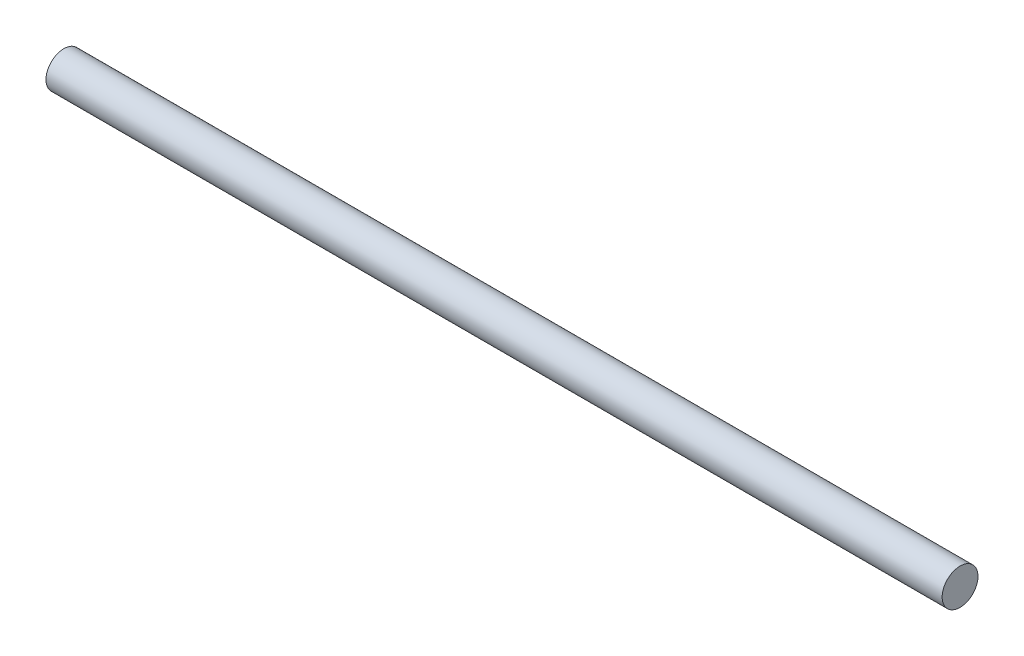
ISO-10303-21;
HEADER;
FILE_DESCRIPTION(('STEP AP214'),'2;1');
FILE_NAME('part.step','',(''),(''),'','','');
FILE_SCHEMA(('AUTOMOTIVE_DESIGN { 1 0 10303 214 1 1 1 1 }'));
ENDSEC;
DATA;
#1=APPLICATION_CONTEXT('core data for automotive mechanical design processes');
#2=APPLICATION_PROTOCOL_DEFINITION('international standard','automotive_design',2000,#1);
#3=PRODUCT_CONTEXT('',#1,'mechanical');
#4=PRODUCT('Part','Part','',(#3));
#5=PRODUCT_RELATED_PRODUCT_CATEGORY('part','',(#4));
#6=PRODUCT_DEFINITION_FORMATION('','',#4);
#7=PRODUCT_DEFINITION_CONTEXT('part definition',#1,'design');
#8=PRODUCT_DEFINITION('design','',#6,#7);
#9=PRODUCT_DEFINITION_SHAPE('','',#8);
#10=(LENGTH_UNIT() NAMED_UNIT(*) SI_UNIT(.MILLI.,.METRE.));
#11=(NAMED_UNIT(*) PLANE_ANGLE_UNIT() SI_UNIT($,.RADIAN.));
#12=(NAMED_UNIT(*) SI_UNIT($,.STERADIAN.) SOLID_ANGLE_UNIT());
#13=UNCERTAINTY_MEASURE_WITH_UNIT(LENGTH_MEASURE(1.E-05),#10,'distance_accuracy_value','');
#14=(GEOMETRIC_REPRESENTATION_CONTEXT(3) GLOBAL_UNCERTAINTY_ASSIGNED_CONTEXT((#13)) GLOBAL_UNIT_ASSIGNED_CONTEXT((#10,
#11,#12)) REPRESENTATION_CONTEXT('',''));
#15=CARTESIAN_POINT('',(0.,0.,0.));
#16=DIRECTION('',(0.,0.,1.));
#17=DIRECTION('',(1.,0.,0.));
#18=AXIS2_PLACEMENT_3D('',#15,#16,#17);
#19=CARTESIAN_POINT('',(300.,0.,0.));
#20=DIRECTION('',(-1.,0.,0.));
#21=DIRECTION('',(0.,0.,1.));
#22=AXIS2_PLACEMENT_3D('',#19,#20,#21);
#23=CYLINDRICAL_SURFACE('',#22,6.);
#24=CARTESIAN_POINT('',(300.,0.,0.));
#25=DIRECTION('',(1.,0.,0.));
#26=DIRECTION('',(0.,0.,-1.));
#27=AXIS2_PLACEMENT_3D('',#24,#25,#26);
#28=CIRCLE('',#27,6.);
#29=CARTESIAN_POINT('',(300.,0.,-6.));
#30=VERTEX_POINT('',#29);
#31=EDGE_CURVE('E10',#30,#30,#28,.T.);
#32=ORIENTED_EDGE('',*,*,#31,.F.);
#33=EDGE_LOOP('',(#32));
#34=FACE_BOUND('',#33,.T.);
#35=CARTESIAN_POINT('',(0.,0.,0.));
#36=DIRECTION('',(1.,0.,0.));
#37=DIRECTION('',(0.,0.,-1.));
#38=AXIS2_PLACEMENT_3D('',#35,#36,#37);
#39=CIRCLE('',#38,6.);
#40=CARTESIAN_POINT('',(0.,0.,-6.));
#41=VERTEX_POINT('',#40);
#42=EDGE_CURVE('E40',#41,#41,#39,.T.);
#43=ORIENTED_EDGE('',*,*,#42,.T.);
#44=EDGE_LOOP('',(#43));
#45=FACE_BOUND('',#44,.T.);
#46=ADVANCED_FACE('F37',(#34,#45),#23,.T.);
#47=CARTESIAN_POINT('',(300.,0.,0.));
#48=DIRECTION('',(1.,0.,0.));
#49=DIRECTION('',(0.,0.,-1.));
#50=AXIS2_PLACEMENT_3D('',#47,#48,#49);
#51=PLANE('',#50);
#52=ORIENTED_EDGE('',*,*,#31,.T.);
#53=EDGE_LOOP('',(#52));
#54=FACE_BOUND('',#53,.T.);
#55=ADVANCED_FACE('F52',(#54),#51,.T.);
#56=CARTESIAN_POINT('',(0.,0.,0.));
#57=DIRECTION('',(1.,0.,0.));
#58=DIRECTION('',(0.,0.,-1.));
#59=AXIS2_PLACEMENT_3D('',#56,#57,#58);
#60=PLANE('',#59);
#61=ORIENTED_EDGE('',*,*,#42,.F.);
#62=EDGE_LOOP('',(#61));
#63=FACE_BOUND('',#62,.T.);
#64=ADVANCED_FACE('F50',(#63),#60,.F.);
#65=CLOSED_SHELL('',(#46,#55,#64));
#66=MANIFOLD_SOLID_BREP('B2',#65);
#67=ADVANCED_BREP_SHAPE_REPRESENTATION('',(#18,#66),#14);
#68=SHAPE_DEFINITION_REPRESENTATION(#9,#67);
ENDSEC;
END-ISO-10303-21;
